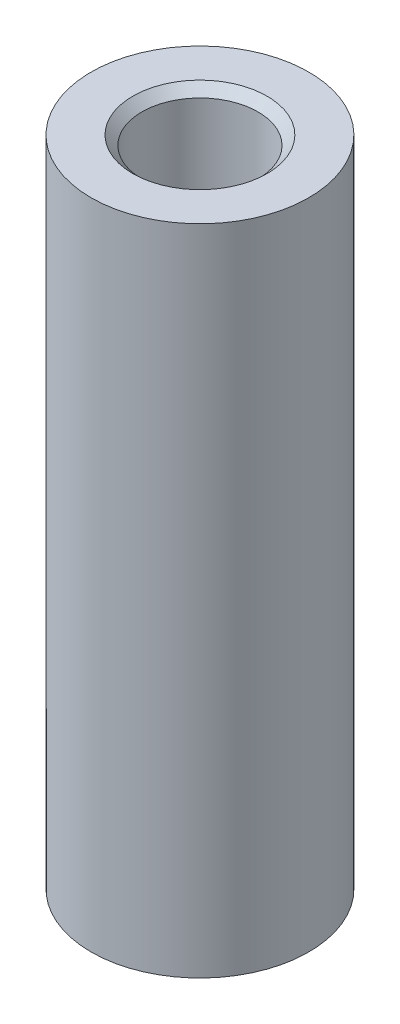
ISO-10303-21;
HEADER;
FILE_DESCRIPTION(('STEP AP214'),'2;1');
FILE_NAME('part.step','',(''),(''),'','','');
FILE_SCHEMA(('AUTOMOTIVE_DESIGN { 1 0 10303 214 1 1 1 1 }'));
ENDSEC;
DATA;
#1=APPLICATION_CONTEXT('core data for automotive mechanical design processes');
#2=APPLICATION_PROTOCOL_DEFINITION('international standard','automotive_design',2000,#1);
#3=PRODUCT_CONTEXT('',#1,'mechanical');
#4=PRODUCT('Part','Part','',(#3));
#5=PRODUCT_RELATED_PRODUCT_CATEGORY('part','',(#4));
#6=PRODUCT_DEFINITION_FORMATION('','',#4);
#7=PRODUCT_DEFINITION_CONTEXT('part definition',#1,'design');
#8=PRODUCT_DEFINITION('design','',#6,#7);
#9=PRODUCT_DEFINITION_SHAPE('','',#8);
#10=(LENGTH_UNIT() NAMED_UNIT(*) SI_UNIT(.MILLI.,.METRE.));
#11=(NAMED_UNIT(*) PLANE_ANGLE_UNIT() SI_UNIT($,.RADIAN.));
#12=(NAMED_UNIT(*) SI_UNIT($,.STERADIAN.) SOLID_ANGLE_UNIT());
#13=UNCERTAINTY_MEASURE_WITH_UNIT(LENGTH_MEASURE(1.E-05),#10,'distance_accuracy_value','');
#14=(GEOMETRIC_REPRESENTATION_CONTEXT(3) GLOBAL_UNCERTAINTY_ASSIGNED_CONTEXT((#13)) GLOBAL_UNIT_ASSIGNED_CONTEXT((#10,
#11,#12)) REPRESENTATION_CONTEXT('',''));
#15=CARTESIAN_POINT('',(0.,0.,0.));
#16=DIRECTION('',(0.,0.,1.));
#17=DIRECTION('',(1.,0.,0.));
#18=AXIS2_PLACEMENT_3D('',#15,#16,#17);
#19=CARTESIAN_POINT('',(0.,18.,0.));
#20=DIRECTION('',(0.,-1.,0.));
#21=DIRECTION('',(0.,0.,-1.));
#22=AXIS2_PLACEMENT_3D('',#19,#20,#21);
#23=CYLINDRICAL_SURFACE('',#22,3.);
#24=CARTESIAN_POINT('',(0.,18.,0.));
#25=DIRECTION('',(0.,1.,0.));
#26=DIRECTION('',(0.,0.,1.));
#27=AXIS2_PLACEMENT_3D('',#24,#25,#26);
#28=CIRCLE('',#27,3.);
#29=CARTESIAN_POINT('',(0.,18.,3.));
#30=VERTEX_POINT('',#29);
#31=EDGE_CURVE('E64',#30,#30,#28,.T.);
#32=ORIENTED_EDGE('',*,*,#31,.F.);
#33=EDGE_LOOP('',(#32));
#34=FACE_BOUND('',#33,.T.);
#35=CARTESIAN_POINT('',(0.,0.,0.));
#36=DIRECTION('',(0.,1.,0.));
#37=DIRECTION('',(0.,0.,1.));
#38=AXIS2_PLACEMENT_3D('',#35,#36,#37);
#39=CIRCLE('',#38,3.);
#40=CARTESIAN_POINT('',(0.,0.,3.));
#41=VERTEX_POINT('',#40);
#42=EDGE_CURVE('E65',#41,#41,#39,.T.);
#43=ORIENTED_EDGE('',*,*,#42,.T.);
#44=EDGE_LOOP('',(#43));
#45=FACE_BOUND('',#44,.T.);
#46=ADVANCED_FACE('F39',(#34,#45),#23,.T.);
#47=CARTESIAN_POINT('',(0.,18.,0.));
#48=DIRECTION('',(0.,1.,0.));
#49=DIRECTION('',(0.,0.,1.));
#50=AXIS2_PLACEMENT_3D('',#47,#48,#49);
#51=PLANE('',#50);
#52=CARTESIAN_POINT('',(0.,18.,0.));
#53=DIRECTION('',(0.,1.,0.));
#54=DIRECTION('',(0.,0.,1.));
#55=AXIS2_PLACEMENT_3D('',#52,#53,#54);
#56=CIRCLE('',#55,1.84999999999999);
#57=CARTESIAN_POINT('',(0.,18.,1.84999999999999));
#58=VERTEX_POINT('',#57);
#59=EDGE_CURVE('E48',#58,#58,#56,.F.);
#60=ORIENTED_EDGE('',*,*,#59,.T.);
#61=EDGE_LOOP('',(#60));
#62=FACE_BOUND('',#61,.T.);
#63=ORIENTED_EDGE('',*,*,#31,.T.);
#64=EDGE_LOOP('',(#63));
#65=FACE_BOUND('',#64,.T.);
#66=ADVANCED_FACE('F73',(#62,#65),#51,.T.);
#67=CARTESIAN_POINT('',(0.,0.,0.));
#68=DIRECTION('',(0.,1.,0.));
#69=DIRECTION('',(0.,0.,1.));
#70=AXIS2_PLACEMENT_3D('',#67,#68,#69);
#71=PLANE('',#70);
#72=CARTESIAN_POINT('',(0.,0.,0.));
#73=DIRECTION('',(0.,1.,0.));
#74=DIRECTION('',(0.,0.,1.));
#75=AXIS2_PLACEMENT_3D('',#72,#73,#74);
#76=CIRCLE('',#75,1.85);
#77=CARTESIAN_POINT('',(0.,0.,1.85));
#78=VERTEX_POINT('',#77);
#79=EDGE_CURVE('E10',#78,#78,#76,.T.);
#80=ORIENTED_EDGE('',*,*,#79,.T.);
#81=EDGE_LOOP('',(#80));
#82=FACE_BOUND('',#81,.T.);
#83=ORIENTED_EDGE('',*,*,#42,.F.);
#84=EDGE_LOOP('',(#83));
#85=FACE_BOUND('',#84,.T.);
#86=ADVANCED_FACE('F80',(#82,#85),#71,.F.);
#87=CARTESIAN_POINT('',(0.,18.,0.));
#88=DIRECTION('',(0.,1.,0.));
#89=DIRECTION('',(0.,0.,1.));
#90=AXIS2_PLACEMENT_3D('',#87,#88,#89);
#91=CYLINDRICAL_SURFACE('',#90,1.59999999999999);
#92=CARTESIAN_POINT('',(0.,17.75,0.));
#93=DIRECTION('',(0.,1.,0.));
#94=DIRECTION('',(0.,0.,1.));
#95=AXIS2_PLACEMENT_3D('',#92,#93,#94);
#96=CIRCLE('',#95,1.59999999999999);
#97=CARTESIAN_POINT('',(0.,17.75,1.59999999999999));
#98=VERTEX_POINT('',#97);
#99=EDGE_CURVE('E53',#98,#98,#96,.T.);
#100=ORIENTED_EDGE('',*,*,#99,.T.);
#101=EDGE_LOOP('',(#100));
#102=FACE_BOUND('',#101,.T.);
#103=CARTESIAN_POINT('',(0.,0.250000000000007,0.));
#104=DIRECTION('',(0.,1.,0.));
#105=DIRECTION('',(0.,0.,1.));
#106=AXIS2_PLACEMENT_3D('',#103,#104,#105);
#107=CIRCLE('',#106,1.59999999999999);
#108=CARTESIAN_POINT('',(0.,0.250000000000007,1.59999999999999));
#109=VERTEX_POINT('',#108);
#110=EDGE_CURVE('E58',#109,#109,#107,.F.);
#111=ORIENTED_EDGE('',*,*,#110,.T.);
#112=EDGE_LOOP('',(#111));
#113=FACE_BOUND('',#112,.T.);
#114=ADVANCED_FACE('F82',(#102,#113),#91,.F.);
#115=CARTESIAN_POINT('',(0.,17.75,0.));
#116=DIRECTION('',(0.,1.,0.));
#117=DIRECTION('',(0.,0.,1.));
#118=AXIS2_PLACEMENT_3D('',#115,#116,#117);
#119=CONICAL_SURFACE('',#118,1.59999999999999,0.785398163397445);
#120=ORIENTED_EDGE('',*,*,#59,.F.);
#121=EDGE_LOOP('',(#120));
#122=FACE_BOUND('',#121,.T.);
#123=ORIENTED_EDGE('',*,*,#99,.F.);
#124=EDGE_LOOP('',(#123));
#125=FACE_BOUND('',#124,.T.);
#126=ADVANCED_FACE('F88',(#122,#125),#119,.F.);
#127=CARTESIAN_POINT('',(0.,0.,0.));
#128=DIRECTION('',(0.,-1.,0.));
#129=DIRECTION('',(0.,0.,-1.));
#130=AXIS2_PLACEMENT_3D('',#127,#128,#129);
#131=CONICAL_SURFACE('',#130,1.85,0.785398163397444);
#132=ORIENTED_EDGE('',*,*,#110,.F.);
#133=EDGE_LOOP('',(#132));
#134=FACE_BOUND('',#133,.T.);
#135=ORIENTED_EDGE('',*,*,#79,.F.);
#136=EDGE_LOOP('',(#135));
#137=FACE_BOUND('',#136,.T.);
#138=ADVANCED_FACE('F42',(#134,#137),#131,.F.);
#139=CLOSED_SHELL('',(#46,#66,#86,#114,#126,#138));
#140=MANIFOLD_SOLID_BREP('B2',#139);
#141=ADVANCED_BREP_SHAPE_REPRESENTATION('',(#18,#140),#14);
#142=SHAPE_DEFINITION_REPRESENTATION(#9,#141);
ENDSEC;
END-ISO-10303-21;
